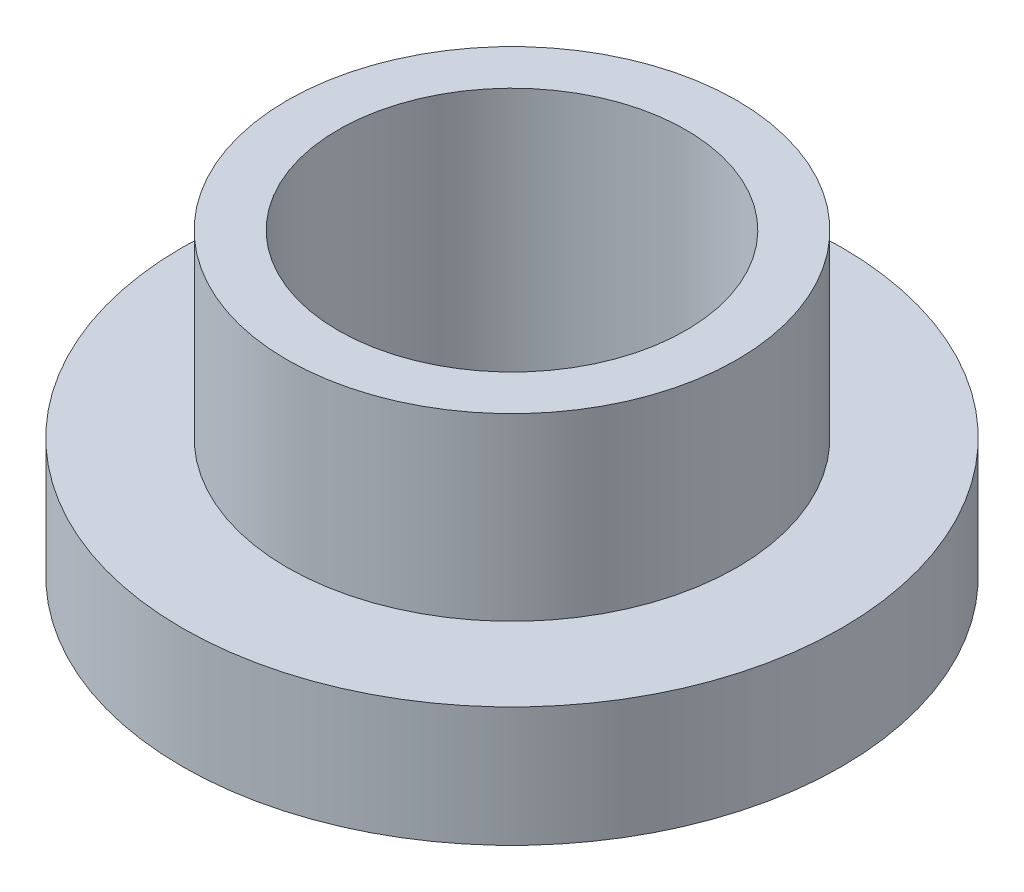
ISO-10303-21;
HEADER;
FILE_DESCRIPTION(('STEP AP214'),'2;1');
FILE_NAME('part.step','',(''),(''),'','','');
FILE_SCHEMA(('AUTOMOTIVE_DESIGN { 1 0 10303 214 1 1 1 1 }'));
ENDSEC;
DATA;
#1=APPLICATION_CONTEXT('core data for automotive mechanical design processes');
#2=APPLICATION_PROTOCOL_DEFINITION('international standard','automotive_design',2000,#1);
#3=PRODUCT_CONTEXT('',#1,'mechanical');
#4=PRODUCT('Part','Part','',(#3));
#5=PRODUCT_RELATED_PRODUCT_CATEGORY('part','',(#4));
#6=PRODUCT_DEFINITION_FORMATION('','',#4);
#7=PRODUCT_DEFINITION_CONTEXT('part definition',#1,'design');
#8=PRODUCT_DEFINITION('design','',#6,#7);
#9=PRODUCT_DEFINITION_SHAPE('','',#8);
#10=(LENGTH_UNIT() NAMED_UNIT(*) SI_UNIT(.MILLI.,.METRE.));
#11=(NAMED_UNIT(*) PLANE_ANGLE_UNIT() SI_UNIT($,.RADIAN.));
#12=(NAMED_UNIT(*) SI_UNIT($,.STERADIAN.) SOLID_ANGLE_UNIT());
#13=UNCERTAINTY_MEASURE_WITH_UNIT(LENGTH_MEASURE(1.E-05),#10,'distance_accuracy_value','');
#14=(GEOMETRIC_REPRESENTATION_CONTEXT(3) GLOBAL_UNCERTAINTY_ASSIGNED_CONTEXT((#13)) GLOBAL_UNIT_ASSIGNED_CONTEXT((#10,
#11,#12)) REPRESENTATION_CONTEXT('',''));
#15=CARTESIAN_POINT('',(0.,0.,0.));
#16=DIRECTION('',(0.,0.,1.));
#17=DIRECTION('',(1.,0.,0.));
#18=AXIS2_PLACEMENT_3D('',#15,#16,#17);
#19=CARTESIAN_POINT('',(0.,2.,0.));
#20=DIRECTION('',(0.,1.,0.));
#21=DIRECTION('',(0.,0.,1.));
#22=AXIS2_PLACEMENT_3D('',#19,#20,#21);
#23=PLANE('',#22);
#24=CARTESIAN_POINT('',(0.,2.,0.));
#25=DIRECTION('',(0.,1.,0.));
#26=DIRECTION('',(0.,0.,1.));
#27=AXIS2_PLACEMENT_3D('',#24,#25,#26);
#28=CIRCLE('',#27,5.5);
#29=CARTESIAN_POINT('',(0.,2.,5.5));
#30=VERTEX_POINT('',#29);
#31=EDGE_CURVE('E10',#30,#30,#28,.T.);
#32=ORIENTED_EDGE('',*,*,#31,.T.);
#33=EDGE_LOOP('',(#32));
#34=FACE_BOUND('',#33,.T.);
#35=CARTESIAN_POINT('',(0.,2.,0.));
#36=DIRECTION('',(0.,1.,0.));
#37=DIRECTION('',(0.,0.,1.));
#38=AXIS2_PLACEMENT_3D('',#35,#36,#37);
#39=CIRCLE('',#38,3.75);
#40=CARTESIAN_POINT('',(0.,2.,3.75));
#41=VERTEX_POINT('',#40);
#42=EDGE_CURVE('E60',#41,#41,#39,.T.);
#43=ORIENTED_EDGE('',*,*,#42,.F.);
#44=EDGE_LOOP('',(#43));
#45=FACE_BOUND('',#44,.T.);
#46=ADVANCED_FACE('F41',(#34,#45),#23,.T.);
#47=CARTESIAN_POINT('',(0.,0.,0.));
#48=DIRECTION('',(0.,1.,0.));
#49=DIRECTION('',(0.,0.,1.));
#50=AXIS2_PLACEMENT_3D('',#47,#48,#49);
#51=PLANE('',#50);
#52=CARTESIAN_POINT('',(0.,0.,0.));
#53=DIRECTION('',(0.,1.,0.));
#54=DIRECTION('',(0.,0.,1.));
#55=AXIS2_PLACEMENT_3D('',#52,#53,#54);
#56=CIRCLE('',#55,5.5);
#57=CARTESIAN_POINT('',(0.,0.,5.5));
#58=VERTEX_POINT('',#57);
#59=EDGE_CURVE('E45',#58,#58,#56,.T.);
#60=ORIENTED_EDGE('',*,*,#59,.F.);
#61=EDGE_LOOP('',(#60));
#62=FACE_BOUND('',#61,.T.);
#63=CARTESIAN_POINT('',(0.,0.,0.));
#64=DIRECTION('',(0.,1.,0.));
#65=DIRECTION('',(0.,0.,1.));
#66=AXIS2_PLACEMENT_3D('',#63,#64,#65);
#67=CIRCLE('',#66,2.9);
#68=CARTESIAN_POINT('',(0.,0.,2.9));
#69=VERTEX_POINT('',#68);
#70=EDGE_CURVE('E54',#69,#69,#67,.T.);
#71=ORIENTED_EDGE('',*,*,#70,.T.);
#72=EDGE_LOOP('',(#71));
#73=FACE_BOUND('',#72,.T.);
#74=ADVANCED_FACE('F88',(#62,#73),#51,.F.);
#75=CARTESIAN_POINT('',(0.,2.,0.));
#76=DIRECTION('',(0.,-1.,0.));
#77=DIRECTION('',(0.,0.,-1.));
#78=AXIS2_PLACEMENT_3D('',#75,#76,#77);
#79=CYLINDRICAL_SURFACE('',#78,5.5);
#80=ORIENTED_EDGE('',*,*,#31,.F.);
#81=EDGE_LOOP('',(#80));
#82=FACE_BOUND('',#81,.T.);
#83=ORIENTED_EDGE('',*,*,#59,.T.);
#84=EDGE_LOOP('',(#83));
#85=FACE_BOUND('',#84,.T.);
#86=ADVANCED_FACE('F43',(#82,#85),#79,.T.);
#87=CARTESIAN_POINT('',(0.,2.,0.));
#88=DIRECTION('',(0.,-1.,0.));
#89=DIRECTION('',(0.,0.,-1.));
#90=AXIS2_PLACEMENT_3D('',#87,#88,#89);
#91=CYLINDRICAL_SURFACE('',#90,2.9);
#92=ORIENTED_EDGE('',*,*,#70,.F.);
#93=EDGE_LOOP('',(#92));
#94=FACE_BOUND('',#93,.T.);
#95=CARTESIAN_POINT('',(0.,5.,0.));
#96=DIRECTION('',(0.,1.,0.));
#97=DIRECTION('',(0.,0.,1.));
#98=AXIS2_PLACEMENT_3D('',#95,#96,#97);
#99=CIRCLE('',#98,2.9);
#100=CARTESIAN_POINT('',(0.,5.,2.9));
#101=VERTEX_POINT('',#100);
#102=EDGE_CURVE('E64',#101,#101,#99,.T.);
#103=ORIENTED_EDGE('',*,*,#102,.T.);
#104=EDGE_LOOP('',(#103));
#105=FACE_BOUND('',#104,.T.);
#106=ADVANCED_FACE('F72',(#94,#105),#91,.F.);
#107=CARTESIAN_POINT('',(0.,5.,0.));
#108=DIRECTION('',(0.,1.,0.));
#109=DIRECTION('',(0.,0.,1.));
#110=AXIS2_PLACEMENT_3D('',#107,#108,#109);
#111=PLANE('',#110);
#112=CARTESIAN_POINT('',(0.,5.,0.));
#113=DIRECTION('',(0.,1.,0.));
#114=DIRECTION('',(0.,0.,1.));
#115=AXIS2_PLACEMENT_3D('',#112,#113,#114);
#116=CIRCLE('',#115,3.75);
#117=CARTESIAN_POINT('',(0.,5.,3.75));
#118=VERTEX_POINT('',#117);
#119=EDGE_CURVE('E59',#118,#118,#116,.T.);
#120=ORIENTED_EDGE('',*,*,#119,.T.);
#121=EDGE_LOOP('',(#120));
#122=FACE_BOUND('',#121,.T.);
#123=ORIENTED_EDGE('',*,*,#102,.F.);
#124=EDGE_LOOP('',(#123));
#125=FACE_BOUND('',#124,.T.);
#126=ADVANCED_FACE('F74',(#122,#125),#111,.T.);
#127=CARTESIAN_POINT('',(0.,5.,0.));
#128=DIRECTION('',(0.,-1.,0.));
#129=DIRECTION('',(0.,0.,-1.));
#130=AXIS2_PLACEMENT_3D('',#127,#128,#129);
#131=CYLINDRICAL_SURFACE('',#130,3.75);
#132=ORIENTED_EDGE('',*,*,#119,.F.);
#133=EDGE_LOOP('',(#132));
#134=FACE_BOUND('',#133,.T.);
#135=ORIENTED_EDGE('',*,*,#42,.T.);
#136=EDGE_LOOP('',(#135));
#137=FACE_BOUND('',#136,.T.);
#138=ADVANCED_FACE('F76',(#134,#137),#131,.T.);
#139=CLOSED_SHELL('',(#46,#74,#86,#106,#126,#138));
#140=MANIFOLD_SOLID_BREP('B2',#139);
#141=ADVANCED_BREP_SHAPE_REPRESENTATION('',(#18,#140),#14);
#142=SHAPE_DEFINITION_REPRESENTATION(#9,#141);
ENDSEC;
END-ISO-10303-21;
